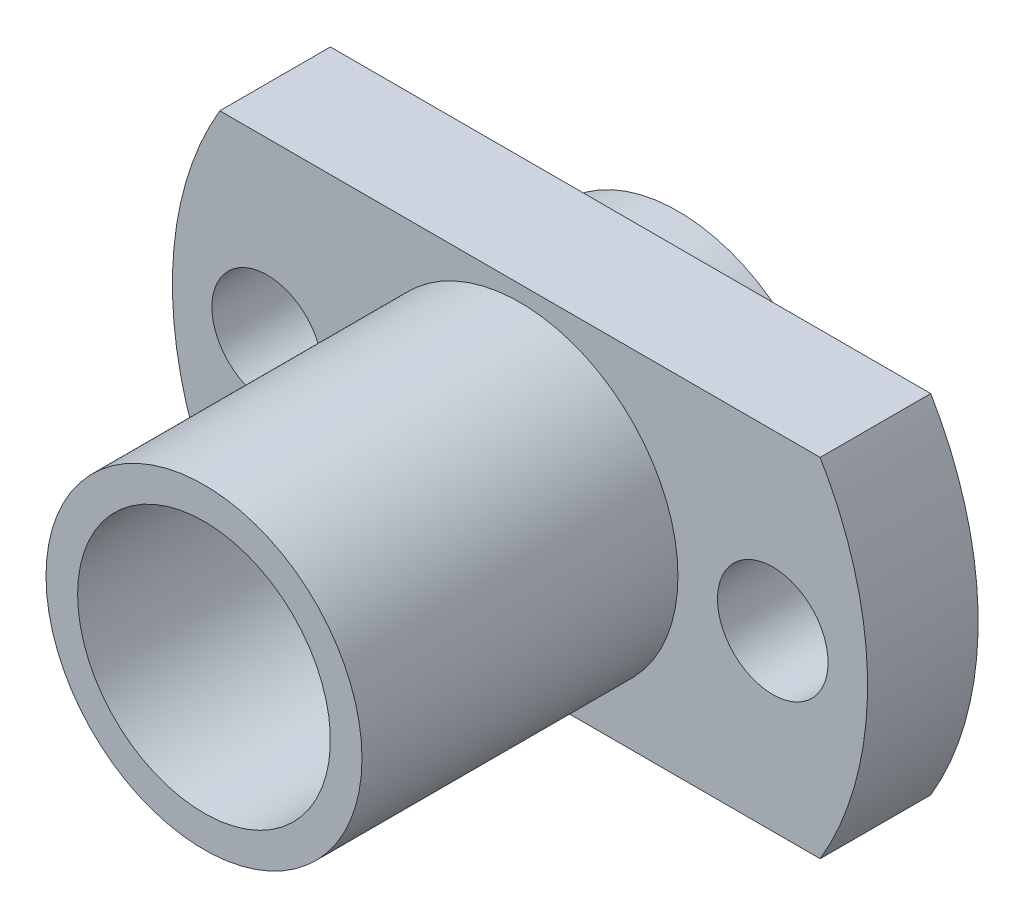
ISO-10303-21;
HEADER;
FILE_DESCRIPTION(('STEP AP214'),'2;1');
FILE_NAME('part.step','',(''),(''),'','','');
FILE_SCHEMA(('AUTOMOTIVE_DESIGN { 1 0 10303 214 1 1 1 1 }'));
ENDSEC;
DATA;
#1=APPLICATION_CONTEXT('core data for automotive mechanical design processes');
#2=APPLICATION_PROTOCOL_DEFINITION('international standard','automotive_design',2000,#1);
#3=PRODUCT_CONTEXT('',#1,'mechanical');
#4=PRODUCT('Part','Part','',(#3));
#5=PRODUCT_RELATED_PRODUCT_CATEGORY('part','',(#4));
#6=PRODUCT_DEFINITION_FORMATION('','',#4);
#7=PRODUCT_DEFINITION_CONTEXT('part definition',#1,'design');
#8=PRODUCT_DEFINITION('design','',#6,#7);
#9=PRODUCT_DEFINITION_SHAPE('','',#8);
#10=(LENGTH_UNIT() NAMED_UNIT(*) SI_UNIT(.MILLI.,.METRE.));
#11=(NAMED_UNIT(*) PLANE_ANGLE_UNIT() SI_UNIT($,.RADIAN.));
#12=(NAMED_UNIT(*) SI_UNIT($,.STERADIAN.) SOLID_ANGLE_UNIT());
#13=UNCERTAINTY_MEASURE_WITH_UNIT(LENGTH_MEASURE(1.E-05),#10,'distance_accuracy_value','');
#14=(GEOMETRIC_REPRESENTATION_CONTEXT(3) GLOBAL_UNCERTAINTY_ASSIGNED_CONTEXT((#13)) GLOBAL_UNIT_ASSIGNED_CONTEXT((#10,
#11,#12)) REPRESENTATION_CONTEXT('',''));
#15=CARTESIAN_POINT('',(0.,0.,0.));
#16=DIRECTION('',(0.,0.,1.));
#17=DIRECTION('',(1.,0.,0.));
#18=AXIS2_PLACEMENT_3D('',#15,#16,#17);
#19=CARTESIAN_POINT('',(0.166666666666615,0.,3.5));
#20=DIRECTION('',(0.,0.,1.));
#21=DIRECTION('',(1.,0.,0.));
#22=AXIS2_PLACEMENT_3D('',#19,#20,#21);
#23=PLANE('',#22);
#24=CARTESIAN_POINT('',(0.,0.,3.5));
#25=DIRECTION('',(0.,0.,1.));
#26=DIRECTION('',(1.,0.,0.));
#27=AXIS2_PLACEMENT_3D('',#24,#25,#26);
#28=CIRCLE('',#27,5.);
#29=CARTESIAN_POINT('',(5.,0.,3.5));
#30=VERTEX_POINT('',#29);
#31=EDGE_CURVE('E11',#30,#30,#28,.T.);
#32=ORIENTED_EDGE('',*,*,#31,.F.);
#33=EDGE_LOOP('',(#32));
#34=FACE_BOUND('',#33,.T.);
#35=CARTESIAN_POINT('',(8.,0.,3.5));
#36=DIRECTION('',(0.,0.,1.));
#37=DIRECTION('',(1.,0.,0.));
#38=AXIS2_PLACEMENT_3D('',#35,#36,#37);
#39=CIRCLE('',#38,1.75);
#40=CARTESIAN_POINT('',(9.75,0.,3.5));
#41=VERTEX_POINT('',#40);
#42=EDGE_CURVE('E109',#41,#41,#39,.T.);
#43=ORIENTED_EDGE('',*,*,#42,.F.);
#44=EDGE_LOOP('',(#43));
#45=FACE_BOUND('',#44,.T.);
#46=CARTESIAN_POINT('',(0.166666666666615,0.,3.5));
#47=DIRECTION('',(0.,0.,1.));
#48=DIRECTION('',(1.,0.,0.));
#49=AXIS2_PLACEMENT_3D('',#46,#47,#48);
#50=CIRCLE('',#49,10.8333333333334);
#51=CARTESIAN_POINT('',(9.50000000000002,-5.5,3.5));
#52=VERTEX_POINT('',#51);
#53=CARTESIAN_POINT('',(9.50000000000002,5.5,3.5));
#54=VERTEX_POINT('',#53);
#55=EDGE_CURVE('E92',#52,#54,#50,.T.);
#56=ORIENTED_EDGE('',*,*,#55,.T.);
#57=DIRECTION('',(-1.,0.,0.));
#58=VECTOR('',#57,1.);
#59=CARTESIAN_POINT('',(-9.49999999999998,5.5,3.5));
#60=LINE('',#59,#58);
#61=CARTESIAN_POINT('',(-9.49999999999998,5.5,3.5));
#62=VERTEX_POINT('',#61);
#63=EDGE_CURVE('E87',#54,#62,#60,.T.);
#64=ORIENTED_EDGE('',*,*,#63,.T.);
#65=CARTESIAN_POINT('',(-0.166666666666648,0.,3.5));
#66=DIRECTION('',(0.,0.,1.));
#67=DIRECTION('',(-1.,0.,0.));
#68=AXIS2_PLACEMENT_3D('',#65,#66,#67);
#69=CIRCLE('',#68,10.8333333333333);
#70=CARTESIAN_POINT('',(-9.49999999999998,-5.5,3.5));
#71=VERTEX_POINT('',#70);
#72=EDGE_CURVE('E90',#62,#71,#69,.T.);
#73=ORIENTED_EDGE('',*,*,#72,.T.);
#74=DIRECTION('',(1.,0.,0.));
#75=VECTOR('',#74,1.);
#76=CARTESIAN_POINT('',(-9.49999999999998,-5.5,3.5));
#77=LINE('',#76,#75);
#78=EDGE_CURVE('E56',#71,#52,#77,.T.);
#79=ORIENTED_EDGE('',*,*,#78,.T.);
#80=EDGE_LOOP('',(#56,#64,#73,#79));
#81=FACE_BOUND('',#80,.T.);
#82=CARTESIAN_POINT('',(-8.,0.,3.5));
#83=DIRECTION('',(0.,0.,1.));
#84=DIRECTION('',(1.,0.,0.));
#85=AXIS2_PLACEMENT_3D('',#82,#83,#84);
#86=CIRCLE('',#85,1.75);
#87=CARTESIAN_POINT('',(-6.25,0.,3.5));
#88=VERTEX_POINT('',#87);
#89=EDGE_CURVE('E130',#88,#88,#86,.T.);
#90=ORIENTED_EDGE('',*,*,#89,.F.);
#91=EDGE_LOOP('',(#90));
#92=FACE_BOUND('',#91,.T.);
#93=ADVANCED_FACE('F37',(#34,#45,#81,#92),#23,.T.);
#94=CARTESIAN_POINT('',(0.166666666666615,0.,0.));
#95=DIRECTION('',(0.,0.,1.));
#96=DIRECTION('',(1.,0.,0.));
#97=AXIS2_PLACEMENT_3D('',#94,#95,#96);
#98=PLANE('',#97);
#99=CARTESIAN_POINT('',(0.,0.,0.));
#100=DIRECTION('',(0.,0.,1.));
#101=DIRECTION('',(1.,0.,0.));
#102=AXIS2_PLACEMENT_3D('',#99,#100,#101);
#103=CIRCLE('',#102,5.);
#104=CARTESIAN_POINT('',(5.,0.,0.));
#105=VERTEX_POINT('',#104);
#106=EDGE_CURVE('E41',#105,#105,#103,.T.);
#107=ORIENTED_EDGE('',*,*,#106,.T.);
#108=EDGE_LOOP('',(#107));
#109=FACE_BOUND('',#108,.T.);
#110=CARTESIAN_POINT('',(0.166666666666615,0.,0.));
#111=DIRECTION('',(0.,0.,1.));
#112=DIRECTION('',(1.,0.,0.));
#113=AXIS2_PLACEMENT_3D('',#110,#111,#112);
#114=CIRCLE('',#113,10.8333333333334);
#115=CARTESIAN_POINT('',(9.50000000000002,-5.5,0.));
#116=VERTEX_POINT('',#115);
#117=CARTESIAN_POINT('',(9.50000000000002,5.5,0.));
#118=VERTEX_POINT('',#117);
#119=EDGE_CURVE('E106',#116,#118,#114,.T.);
#120=ORIENTED_EDGE('',*,*,#119,.F.);
#121=DIRECTION('',(1.,0.,0.));
#122=VECTOR('',#121,1.);
#123=CARTESIAN_POINT('',(-9.49999999999998,-5.5,0.));
#124=LINE('',#123,#122);
#125=CARTESIAN_POINT('',(-9.49999999999998,-5.5,0.));
#126=VERTEX_POINT('',#125);
#127=EDGE_CURVE('E79',#126,#116,#124,.T.);
#128=ORIENTED_EDGE('',*,*,#127,.F.);
#129=CARTESIAN_POINT('',(-0.166666666666648,0.,0.));
#130=DIRECTION('',(0.,0.,1.));
#131=DIRECTION('',(-1.,0.,0.));
#132=AXIS2_PLACEMENT_3D('',#129,#130,#131);
#133=CIRCLE('',#132,10.8333333333333);
#134=CARTESIAN_POINT('',(-9.49999999999998,5.5,0.));
#135=VERTEX_POINT('',#134);
#136=EDGE_CURVE('E73',#135,#126,#133,.T.);
#137=ORIENTED_EDGE('',*,*,#136,.F.);
#138=DIRECTION('',(-1.,0.,0.));
#139=VECTOR('',#138,1.);
#140=CARTESIAN_POINT('',(-9.49999999999998,5.5,0.));
#141=LINE('',#140,#139);
#142=EDGE_CURVE('E97',#118,#135,#141,.T.);
#143=ORIENTED_EDGE('',*,*,#142,.F.);
#144=EDGE_LOOP('',(#120,#128,#137,#143));
#145=FACE_BOUND('',#144,.T.);
#146=CARTESIAN_POINT('',(8.,0.,0.));
#147=DIRECTION('',(0.,0.,1.));
#148=DIRECTION('',(1.,0.,0.));
#149=AXIS2_PLACEMENT_3D('',#146,#147,#148);
#150=CIRCLE('',#149,1.75);
#151=CARTESIAN_POINT('',(9.75,0.,0.));
#152=VERTEX_POINT('',#151);
#153=EDGE_CURVE('E125',#152,#152,#150,.T.);
#154=ORIENTED_EDGE('',*,*,#153,.T.);
#155=EDGE_LOOP('',(#154));
#156=FACE_BOUND('',#155,.T.);
#157=CARTESIAN_POINT('',(-8.,0.,0.));
#158=DIRECTION('',(0.,0.,1.));
#159=DIRECTION('',(1.,0.,0.));
#160=AXIS2_PLACEMENT_3D('',#157,#158,#159);
#161=CIRCLE('',#160,1.75);
#162=CARTESIAN_POINT('',(-6.25,0.,0.));
#163=VERTEX_POINT('',#162);
#164=EDGE_CURVE('E128',#163,#163,#161,.T.);
#165=ORIENTED_EDGE('',*,*,#164,.T.);
#166=EDGE_LOOP('',(#165));
#167=FACE_BOUND('',#166,.T.);
#168=ADVANCED_FACE('F117',(#109,#145,#156,#167),#98,.F.);
#169=CARTESIAN_POINT('',(0.166666666666615,0.,3.5));
#170=DIRECTION('',(0.,0.,-1.));
#171=DIRECTION('',(-1.,0.,0.));
#172=AXIS2_PLACEMENT_3D('',#169,#170,#171);
#173=CYLINDRICAL_SURFACE('',#172,10.8333333333334);
#174=ORIENTED_EDGE('',*,*,#119,.T.);
#175=DIRECTION('',(0.,0.,-1.));
#176=VECTOR('',#175,1.);
#177=CARTESIAN_POINT('',(9.50000000000002,5.5,3.5));
#178=LINE('',#177,#176);
#179=EDGE_CURVE('E47',#54,#118,#178,.T.);
#180=ORIENTED_EDGE('',*,*,#179,.F.);
#181=ORIENTED_EDGE('',*,*,#55,.F.);
#182=DIRECTION('',(0.,0.,-1.));
#183=VECTOR('',#182,1.);
#184=CARTESIAN_POINT('',(9.50000000000002,-5.5,3.5));
#185=LINE('',#184,#183);
#186=EDGE_CURVE('E102',#52,#116,#185,.T.);
#187=ORIENTED_EDGE('',*,*,#186,.T.);
#188=EDGE_LOOP('',(#174,#180,#181,#187));
#189=FACE_BOUND('',#188,.T.);
#190=ADVANCED_FACE('F39',(#189),#173,.T.);
#191=CARTESIAN_POINT('',(-9.49999999999998,5.5,3.5));
#192=DIRECTION('',(0.,-1.,0.));
#193=DIRECTION('',(0.,0.,-1.));
#194=AXIS2_PLACEMENT_3D('',#191,#192,#193);
#195=PLANE('',#194);
#196=ORIENTED_EDGE('',*,*,#142,.T.);
#197=DIRECTION('',(0.,0.,-1.));
#198=VECTOR('',#197,1.);
#199=CARTESIAN_POINT('',(-9.49999999999998,5.5,3.5));
#200=LINE('',#199,#198);
#201=EDGE_CURVE('E95',#62,#135,#200,.T.);
#202=ORIENTED_EDGE('',*,*,#201,.F.);
#203=ORIENTED_EDGE('',*,*,#63,.F.);
#204=ORIENTED_EDGE('',*,*,#179,.T.);
#205=EDGE_LOOP('',(#196,#202,#203,#204));
#206=FACE_BOUND('',#205,.T.);
#207=ADVANCED_FACE('F96',(#206),#195,.F.);
#208=CARTESIAN_POINT('',(-0.166666666666648,0.,3.5));
#209=DIRECTION('',(0.,0.,-1.));
#210=DIRECTION('',(-1.,0.,0.));
#211=AXIS2_PLACEMENT_3D('',#208,#209,#210);
#212=CYLINDRICAL_SURFACE('',#211,10.8333333333333);
#213=ORIENTED_EDGE('',*,*,#136,.T.);
#214=DIRECTION('',(0.,0.,-1.));
#215=VECTOR('',#214,1.);
#216=CARTESIAN_POINT('',(-9.49999999999998,-5.5,3.5));
#217=LINE('',#216,#215);
#218=EDGE_CURVE('E98',#71,#126,#217,.T.);
#219=ORIENTED_EDGE('',*,*,#218,.F.);
#220=ORIENTED_EDGE('',*,*,#72,.F.);
#221=ORIENTED_EDGE('',*,*,#201,.T.);
#222=EDGE_LOOP('',(#213,#219,#220,#221));
#223=FACE_BOUND('',#222,.T.);
#224=ADVANCED_FACE('F100',(#223),#212,.T.);
#225=CARTESIAN_POINT('',(-9.49999999999998,-5.5,3.5));
#226=DIRECTION('',(0.,1.,0.));
#227=DIRECTION('',(0.,0.,1.));
#228=AXIS2_PLACEMENT_3D('',#225,#226,#227);
#229=PLANE('',#228);
#230=ORIENTED_EDGE('',*,*,#127,.T.);
#231=ORIENTED_EDGE('',*,*,#186,.F.);
#232=ORIENTED_EDGE('',*,*,#78,.F.);
#233=ORIENTED_EDGE('',*,*,#218,.T.);
#234=EDGE_LOOP('',(#230,#231,#232,#233));
#235=FACE_BOUND('',#234,.T.);
#236=ADVANCED_FACE('F153',(#235),#229,.F.);
#237=CARTESIAN_POINT('',(8.,0.,3.5));
#238=DIRECTION('',(0.,0.,-1.));
#239=DIRECTION('',(-1.,0.,0.));
#240=AXIS2_PLACEMENT_3D('',#237,#238,#239);
#241=CYLINDRICAL_SURFACE('',#240,1.75);
#242=ORIENTED_EDGE('',*,*,#42,.T.);
#243=EDGE_LOOP('',(#242));
#244=FACE_BOUND('',#243,.T.);
#245=ORIENTED_EDGE('',*,*,#153,.F.);
#246=EDGE_LOOP('',(#245));
#247=FACE_BOUND('',#246,.T.);
#248=ADVANCED_FACE('F141',(#244,#247),#241,.F.);
#249=CARTESIAN_POINT('',(-8.,0.,3.5));
#250=DIRECTION('',(0.,0.,-1.));
#251=DIRECTION('',(-1.,0.,0.));
#252=AXIS2_PLACEMENT_3D('',#249,#250,#251);
#253=CYLINDRICAL_SURFACE('',#252,1.75);
#254=ORIENTED_EDGE('',*,*,#89,.T.);
#255=EDGE_LOOP('',(#254));
#256=FACE_BOUND('',#255,.T.);
#257=ORIENTED_EDGE('',*,*,#164,.F.);
#258=EDGE_LOOP('',(#257));
#259=FACE_BOUND('',#258,.T.);
#260=ADVANCED_FACE('F181',(#256,#259),#253,.F.);
#261=CARTESIAN_POINT('',(0.,0.,13.5));
#262=DIRECTION('',(0.,0.,-1.));
#263=DIRECTION('',(-1.,0.,0.));
#264=AXIS2_PLACEMENT_3D('',#261,#262,#263);
#265=CYLINDRICAL_SURFACE('',#264,5.);
#266=CARTESIAN_POINT('',(0.,0.,-1.5));
#267=DIRECTION('',(0.,0.,-1.));
#268=DIRECTION('',(-1.,0.,0.));
#269=AXIS2_PLACEMENT_3D('',#266,#267,#268);
#270=CIRCLE('',#269,5.);
#271=CARTESIAN_POINT('',(-5.,0.,-1.5));
#272=VERTEX_POINT('',#271);
#273=EDGE_CURVE('E267',#272,#272,#270,.T.);
#274=ORIENTED_EDGE('',*,*,#273,.F.);
#275=EDGE_LOOP('',(#274));
#276=FACE_BOUND('',#275,.T.);
#277=ORIENTED_EDGE('',*,*,#106,.F.);
#278=EDGE_LOOP('',(#277));
#279=FACE_BOUND('',#278,.T.);
#280=ADVANCED_FACE('F175',(#276,#279),#265,.T.);
#281=CARTESIAN_POINT('',(0.,0.,-1.5));
#282=DIRECTION('',(0.,0.,-1.));
#283=DIRECTION('',(-1.,0.,0.));
#284=AXIS2_PLACEMENT_3D('',#281,#282,#283);
#285=PLANE('',#284);
#286=ORIENTED_EDGE('',*,*,#273,.T.);
#287=EDGE_LOOP('',(#286));
#288=FACE_BOUND('',#287,.T.);
#289=CARTESIAN_POINT('',(0.,0.,-1.5));
#290=DIRECTION('',(0.,0.,-1.));
#291=DIRECTION('',(-1.,0.,0.));
#292=AXIS2_PLACEMENT_3D('',#289,#290,#291);
#293=CIRCLE('',#292,4.);
#294=CARTESIAN_POINT('',(-4.,0.,-1.5));
#295=VERTEX_POINT('',#294);
#296=EDGE_CURVE('E263',#295,#295,#293,.T.);
#297=ORIENTED_EDGE('',*,*,#296,.F.);
#298=EDGE_LOOP('',(#297));
#299=FACE_BOUND('',#298,.T.);
#300=ADVANCED_FACE('F180',(#288,#299),#285,.T.);
#301=CARTESIAN_POINT('',(0.,0.,13.5));
#302=DIRECTION('',(0.,0.,-1.));
#303=DIRECTION('',(-1.,0.,0.));
#304=AXIS2_PLACEMENT_3D('',#301,#302,#303);
#305=CYLINDRICAL_SURFACE('',#304,4.);
#306=ORIENTED_EDGE('',*,*,#296,.T.);
#307=EDGE_LOOP('',(#306));
#308=FACE_BOUND('',#307,.T.);
#309=CARTESIAN_POINT('',(0.,0.,13.5));
#310=DIRECTION('',(0.,0.,-1.));
#311=DIRECTION('',(-1.,0.,0.));
#312=AXIS2_PLACEMENT_3D('',#309,#310,#311);
#313=CIRCLE('',#312,4.);
#314=CARTESIAN_POINT('',(-4.,0.,13.5));
#315=VERTEX_POINT('',#314);
#316=EDGE_CURVE('E266',#315,#315,#313,.T.);
#317=ORIENTED_EDGE('',*,*,#316,.F.);
#318=EDGE_LOOP('',(#317));
#319=FACE_BOUND('',#318,.T.);
#320=ADVANCED_FACE('F194',(#308,#319),#305,.F.);
#321=ORIENTED_EDGE('',*,*,#31,.T.);
#322=EDGE_LOOP('',(#321));
#323=FACE_BOUND('',#322,.T.);
#324=CARTESIAN_POINT('',(0.,0.,13.5));
#325=DIRECTION('',(0.,0.,-1.));
#326=DIRECTION('',(-1.,0.,0.));
#327=AXIS2_PLACEMENT_3D('',#324,#325,#326);
#328=CIRCLE('',#327,5.);
#329=CARTESIAN_POINT('',(-5.,0.,13.5));
#330=VERTEX_POINT('',#329);
#331=EDGE_CURVE('E135',#330,#330,#328,.T.);
#332=ORIENTED_EDGE('',*,*,#331,.T.);
#333=EDGE_LOOP('',(#332));
#334=FACE_BOUND('',#333,.T.);
#335=ADVANCED_FACE('F184',(#323,#334),#265,.T.);
#336=CARTESIAN_POINT('',(0.,0.,13.5));
#337=DIRECTION('',(0.,0.,-1.));
#338=DIRECTION('',(-1.,0.,0.));
#339=AXIS2_PLACEMENT_3D('',#336,#337,#338);
#340=PLANE('',#339);
#341=ORIENTED_EDGE('',*,*,#316,.T.);
#342=EDGE_LOOP('',(#341));
#343=FACE_BOUND('',#342,.T.);
#344=ORIENTED_EDGE('',*,*,#331,.F.);
#345=EDGE_LOOP('',(#344));
#346=FACE_BOUND('',#345,.T.);
#347=ADVANCED_FACE('F206',(#343,#346),#340,.F.);
#348=CLOSED_SHELL('',(#93,#168,#190,#207,#224,#236,#248,#260,#280,#300,#320,#335,#347));
#349=MANIFOLD_SOLID_BREP('B2',#348);
#350=ADVANCED_BREP_SHAPE_REPRESENTATION('',(#18,#349),#14);
#351=SHAPE_DEFINITION_REPRESENTATION(#9,#350);
ENDSEC;
END-ISO-10303-21;
